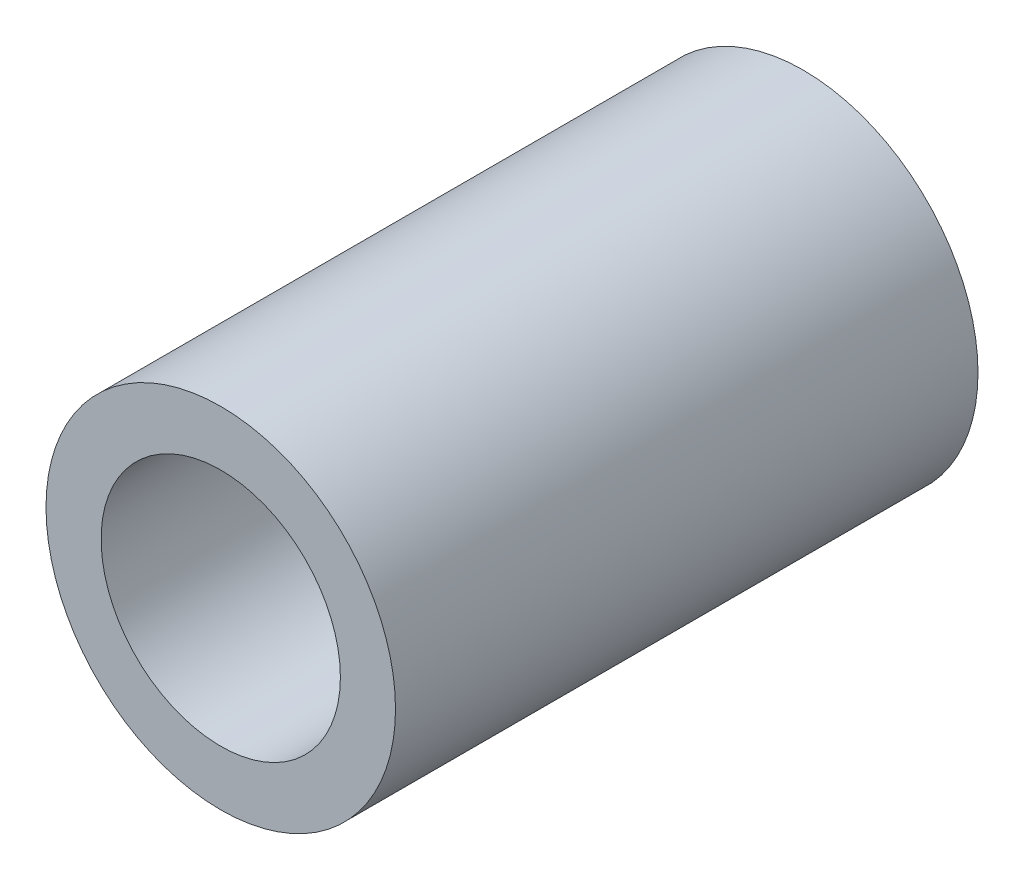
ISO-10303-21;
HEADER;
FILE_DESCRIPTION(('STEP AP214'),'2;1');
FILE_NAME('part.step','',(''),(''),'','','');
FILE_SCHEMA(('AUTOMOTIVE_DESIGN { 1 0 10303 214 1 1 1 1 }'));
ENDSEC;
DATA;
#1=APPLICATION_CONTEXT('core data for automotive mechanical design processes');
#2=APPLICATION_PROTOCOL_DEFINITION('international standard','automotive_design',2000,#1);
#3=PRODUCT_CONTEXT('',#1,'mechanical');
#4=PRODUCT('Part','Part','',(#3));
#5=PRODUCT_RELATED_PRODUCT_CATEGORY('part','',(#4));
#6=PRODUCT_DEFINITION_FORMATION('','',#4);
#7=PRODUCT_DEFINITION_CONTEXT('part definition',#1,'design');
#8=PRODUCT_DEFINITION('design','',#6,#7);
#9=PRODUCT_DEFINITION_SHAPE('','',#8);
#10=(LENGTH_UNIT() NAMED_UNIT(*) SI_UNIT(.MILLI.,.METRE.));
#11=(NAMED_UNIT(*) PLANE_ANGLE_UNIT() SI_UNIT($,.RADIAN.));
#12=(NAMED_UNIT(*) SI_UNIT($,.STERADIAN.) SOLID_ANGLE_UNIT());
#13=UNCERTAINTY_MEASURE_WITH_UNIT(LENGTH_MEASURE(1.E-05),#10,'distance_accuracy_value','');
#14=(GEOMETRIC_REPRESENTATION_CONTEXT(3) GLOBAL_UNCERTAINTY_ASSIGNED_CONTEXT((#13)) GLOBAL_UNIT_ASSIGNED_CONTEXT((#10,
#11,#12)) REPRESENTATION_CONTEXT('',''));
#15=CARTESIAN_POINT('',(0.,0.,0.));
#16=DIRECTION('',(0.,0.,1.));
#17=DIRECTION('',(1.,0.,0.));
#18=AXIS2_PLACEMENT_3D('',#15,#16,#17);
#19=CARTESIAN_POINT('',(0.,0.,25.));
#20=DIRECTION('',(0.,0.,1.));
#21=DIRECTION('',(1.,0.,0.));
#22=AXIS2_PLACEMENT_3D('',#19,#20,#21);
#23=PLANE('',#22);
#24=CARTESIAN_POINT('',(0.,0.,25.));
#25=DIRECTION('',(0.,0.,1.));
#26=DIRECTION('',(1.,0.,0.));
#27=AXIS2_PLACEMENT_3D('',#24,#25,#26);
#28=CIRCLE('',#27,7.5);
#29=CARTESIAN_POINT('',(7.5,0.,25.));
#30=VERTEX_POINT('',#29);
#31=EDGE_CURVE('E10',#30,#30,#28,.T.);
#32=ORIENTED_EDGE('',*,*,#31,.T.);
#33=EDGE_LOOP('',(#32));
#34=FACE_BOUND('',#33,.T.);
#35=CARTESIAN_POINT('',(0.,0.,25.));
#36=DIRECTION('',(0.,0.,1.));
#37=DIRECTION('',(1.,0.,0.));
#38=AXIS2_PLACEMENT_3D('',#35,#36,#37);
#39=CIRCLE('',#38,5.135);
#40=CARTESIAN_POINT('',(5.135,0.,25.));
#41=VERTEX_POINT('',#40);
#42=EDGE_CURVE('E42',#41,#41,#39,.T.);
#43=ORIENTED_EDGE('',*,*,#42,.F.);
#44=EDGE_LOOP('',(#43));
#45=FACE_BOUND('',#44,.T.);
#46=ADVANCED_FACE('F31',(#34,#45),#23,.T.);
#47=CARTESIAN_POINT('',(0.,0.,0.));
#48=DIRECTION('',(0.,0.,1.));
#49=DIRECTION('',(1.,0.,0.));
#50=AXIS2_PLACEMENT_3D('',#47,#48,#49);
#51=PLANE('',#50);
#52=CARTESIAN_POINT('',(0.,0.,0.));
#53=DIRECTION('',(0.,0.,1.));
#54=DIRECTION('',(1.,0.,0.));
#55=AXIS2_PLACEMENT_3D('',#52,#53,#54);
#56=CIRCLE('',#55,7.5);
#57=CARTESIAN_POINT('',(7.5,0.,0.));
#58=VERTEX_POINT('',#57);
#59=EDGE_CURVE('E35',#58,#58,#56,.T.);
#60=ORIENTED_EDGE('',*,*,#59,.F.);
#61=EDGE_LOOP('',(#60));
#62=FACE_BOUND('',#61,.T.);
#63=CARTESIAN_POINT('',(0.,0.,0.));
#64=DIRECTION('',(0.,0.,1.));
#65=DIRECTION('',(1.,0.,0.));
#66=AXIS2_PLACEMENT_3D('',#63,#64,#65);
#67=CIRCLE('',#66,5.135);
#68=CARTESIAN_POINT('',(5.135,0.,0.));
#69=VERTEX_POINT('',#68);
#70=EDGE_CURVE('E44',#69,#69,#67,.T.);
#71=ORIENTED_EDGE('',*,*,#70,.T.);
#72=EDGE_LOOP('',(#71));
#73=FACE_BOUND('',#72,.T.);
#74=ADVANCED_FACE('F54',(#62,#73),#51,.F.);
#75=CARTESIAN_POINT('',(0.,0.,25.));
#76=DIRECTION('',(0.,0.,-1.));
#77=DIRECTION('',(-1.,0.,0.));
#78=AXIS2_PLACEMENT_3D('',#75,#76,#77);
#79=CYLINDRICAL_SURFACE('',#78,7.5);
#80=ORIENTED_EDGE('',*,*,#31,.F.);
#81=EDGE_LOOP('',(#80));
#82=FACE_BOUND('',#81,.T.);
#83=ORIENTED_EDGE('',*,*,#59,.T.);
#84=EDGE_LOOP('',(#83));
#85=FACE_BOUND('',#84,.T.);
#86=ADVANCED_FACE('F33',(#82,#85),#79,.T.);
#87=CARTESIAN_POINT('',(0.,0.,25.));
#88=DIRECTION('',(0.,0.,-1.));
#89=DIRECTION('',(-1.,0.,0.));
#90=AXIS2_PLACEMENT_3D('',#87,#88,#89);
#91=CYLINDRICAL_SURFACE('',#90,5.135);
#92=ORIENTED_EDGE('',*,*,#42,.T.);
#93=EDGE_LOOP('',(#92));
#94=FACE_BOUND('',#93,.T.);
#95=ORIENTED_EDGE('',*,*,#70,.F.);
#96=EDGE_LOOP('',(#95));
#97=FACE_BOUND('',#96,.T.);
#98=ADVANCED_FACE('F50',(#94,#97),#91,.F.);
#99=CLOSED_SHELL('',(#46,#74,#86,#98));
#100=MANIFOLD_SOLID_BREP('B2',#99);
#101=ADVANCED_BREP_SHAPE_REPRESENTATION('',(#18,#100),#14);
#102=SHAPE_DEFINITION_REPRESENTATION(#9,#101);
ENDSEC;
END-ISO-10303-21;
